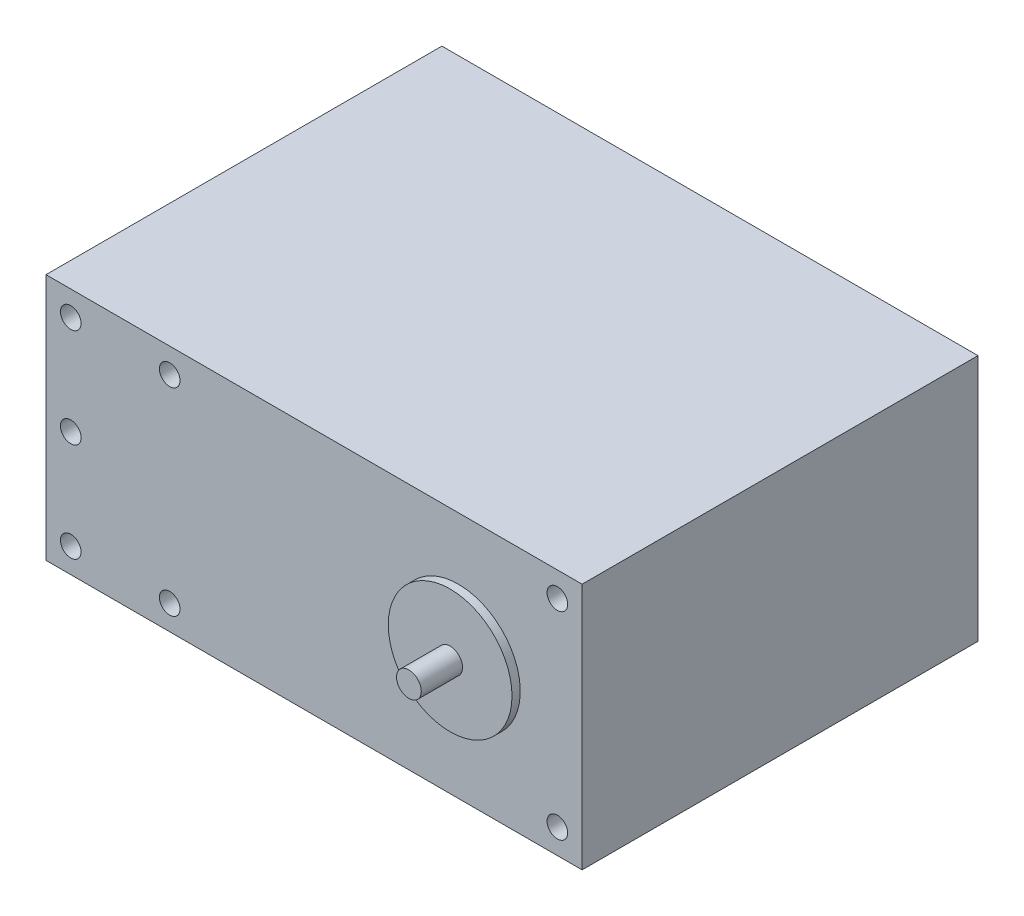
ISO-10303-21;
HEADER;
FILE_DESCRIPTION(('STEP AP214'),'2;1');
FILE_NAME('part.step','',(''),(''),'','','');
FILE_SCHEMA(('AUTOMOTIVE_DESIGN { 1 0 10303 214 1 1 1 1 }'));
ENDSEC;
DATA;
#1=APPLICATION_CONTEXT('core data for automotive mechanical design processes');
#2=APPLICATION_PROTOCOL_DEFINITION('international standard','automotive_design',2000,#1);
#3=PRODUCT_CONTEXT('',#1,'mechanical');
#4=PRODUCT('Part','Part','',(#3));
#5=PRODUCT_RELATED_PRODUCT_CATEGORY('part','',(#4));
#6=PRODUCT_DEFINITION_FORMATION('','',#4);
#7=PRODUCT_DEFINITION_CONTEXT('part definition',#1,'design');
#8=PRODUCT_DEFINITION('design','',#6,#7);
#9=PRODUCT_DEFINITION_SHAPE('','',#8);
#10=(LENGTH_UNIT() NAMED_UNIT(*) SI_UNIT(.MILLI.,.METRE.));
#11=(NAMED_UNIT(*) PLANE_ANGLE_UNIT() SI_UNIT($,.RADIAN.));
#12=(NAMED_UNIT(*) SI_UNIT($,.STERADIAN.) SOLID_ANGLE_UNIT());
#13=UNCERTAINTY_MEASURE_WITH_UNIT(LENGTH_MEASURE(1.E-05),#10,'distance_accuracy_value','');
#14=(GEOMETRIC_REPRESENTATION_CONTEXT(3) GLOBAL_UNCERTAINTY_ASSIGNED_CONTEXT((#13)) GLOBAL_UNIT_ASSIGNED_CONTEXT((#10,
#11,#12)) REPRESENTATION_CONTEXT('',''));
#15=CARTESIAN_POINT('',(0.,0.,0.));
#16=DIRECTION('',(0.,0.,1.));
#17=DIRECTION('',(1.,0.,0.));
#18=AXIS2_PLACEMENT_3D('',#15,#16,#17);
#19=CARTESIAN_POINT('',(0.,0.,48.));
#20=DIRECTION('',(1.,0.,0.));
#21=DIRECTION('',(0.,0.,-1.));
#22=AXIS2_PLACEMENT_3D('',#19,#20,#21);
#23=PLANE('',#22);
#24=DIRECTION('',(0.,-1.,0.));
#25=VECTOR('',#24,1.);
#26=CARTESIAN_POINT('',(0.,0.,0.));
#27=LINE('',#26,#25);
#28=CARTESIAN_POINT('',(0.,30.,0.));
#29=VERTEX_POINT('',#28);
#30=CARTESIAN_POINT('',(0.,0.,0.));
#31=VERTEX_POINT('',#30);
#32=EDGE_CURVE('E99',#29,#31,#27,.T.);
#33=ORIENTED_EDGE('',*,*,#32,.T.);
#34=DIRECTION('',(0.,0.,-1.));
#35=VECTOR('',#34,1.);
#36=CARTESIAN_POINT('',(0.,0.,48.));
#37=LINE('',#36,#35);
#38=CARTESIAN_POINT('',(0.,0.,48.));
#39=VERTEX_POINT('',#38);
#40=EDGE_CURVE('E41',#39,#31,#37,.T.);
#41=ORIENTED_EDGE('',*,*,#40,.F.);
#42=DIRECTION('',(0.,-1.,0.));
#43=VECTOR('',#42,1.);
#44=CARTESIAN_POINT('',(0.,0.,48.));
#45=LINE('',#44,#43);
#46=CARTESIAN_POINT('',(0.,30.,48.));
#47=VERTEX_POINT('',#46);
#48=EDGE_CURVE('E85',#47,#39,#45,.T.);
#49=ORIENTED_EDGE('',*,*,#48,.F.);
#50=DIRECTION('',(0.,0.,-1.));
#51=VECTOR('',#50,1.);
#52=CARTESIAN_POINT('',(0.,30.,48.));
#53=LINE('',#52,#51);
#54=EDGE_CURVE('E95',#47,#29,#53,.T.);
#55=ORIENTED_EDGE('',*,*,#54,.T.);
#56=EDGE_LOOP('',(#33,#41,#49,#55));
#57=FACE_BOUND('',#56,.T.);
#58=ADVANCED_FACE('F33',(#57),#23,.F.);
#59=CARTESIAN_POINT('',(0.,0.,48.));
#60=DIRECTION('',(0.,1.,0.));
#61=DIRECTION('',(0.,0.,1.));
#62=AXIS2_PLACEMENT_3D('',#59,#60,#61);
#63=PLANE('',#62);
#64=DIRECTION('',(1.,0.,0.));
#65=VECTOR('',#64,1.);
#66=CARTESIAN_POINT('',(0.,0.,0.));
#67=LINE('',#66,#65);
#68=CARTESIAN_POINT('',(65.,0.,0.));
#69=VERTEX_POINT('',#68);
#70=EDGE_CURVE('E90',#31,#69,#67,.T.);
#71=ORIENTED_EDGE('',*,*,#70,.T.);
#72=DIRECTION('',(0.,0.,-1.));
#73=VECTOR('',#72,1.);
#74=CARTESIAN_POINT('',(65.,0.,48.));
#75=LINE('',#74,#73);
#76=CARTESIAN_POINT('',(65.,0.,48.));
#77=VERTEX_POINT('',#76);
#78=EDGE_CURVE('E88',#77,#69,#75,.T.);
#79=ORIENTED_EDGE('',*,*,#78,.F.);
#80=DIRECTION('',(1.,0.,0.));
#81=VECTOR('',#80,1.);
#82=CARTESIAN_POINT('',(0.,0.,48.));
#83=LINE('',#82,#81);
#84=EDGE_CURVE('E80',#39,#77,#83,.T.);
#85=ORIENTED_EDGE('',*,*,#84,.F.);
#86=ORIENTED_EDGE('',*,*,#40,.T.);
#87=EDGE_LOOP('',(#71,#79,#85,#86));
#88=FACE_BOUND('',#87,.T.);
#89=ADVANCED_FACE('F89',(#88),#63,.F.);
#90=CARTESIAN_POINT('',(65.,0.,48.));
#91=DIRECTION('',(-1.,0.,0.));
#92=DIRECTION('',(0.,0.,1.));
#93=AXIS2_PLACEMENT_3D('',#90,#91,#92);
#94=PLANE('',#93);
#95=DIRECTION('',(0.,1.,0.));
#96=VECTOR('',#95,1.);
#97=CARTESIAN_POINT('',(65.,0.,0.));
#98=LINE('',#97,#96);
#99=CARTESIAN_POINT('',(65.,30.,0.));
#100=VERTEX_POINT('',#99);
#101=EDGE_CURVE('E66',#69,#100,#98,.T.);
#102=ORIENTED_EDGE('',*,*,#101,.T.);
#103=DIRECTION('',(0.,0.,-1.));
#104=VECTOR('',#103,1.);
#105=CARTESIAN_POINT('',(65.,30.,48.));
#106=LINE('',#105,#104);
#107=CARTESIAN_POINT('',(65.,30.,48.));
#108=VERTEX_POINT('',#107);
#109=EDGE_CURVE('E91',#108,#100,#106,.T.);
#110=ORIENTED_EDGE('',*,*,#109,.F.);
#111=DIRECTION('',(0.,1.,0.));
#112=VECTOR('',#111,1.);
#113=CARTESIAN_POINT('',(65.,0.,48.));
#114=LINE('',#113,#112);
#115=EDGE_CURVE('E83',#77,#108,#114,.T.);
#116=ORIENTED_EDGE('',*,*,#115,.F.);
#117=ORIENTED_EDGE('',*,*,#78,.T.);
#118=EDGE_LOOP('',(#102,#110,#116,#117));
#119=FACE_BOUND('',#118,.T.);
#120=ADVANCED_FACE('F93',(#119),#94,.F.);
#121=CARTESIAN_POINT('',(0.,30.,48.));
#122=DIRECTION('',(0.,-1.,0.));
#123=DIRECTION('',(0.,0.,-1.));
#124=AXIS2_PLACEMENT_3D('',#121,#122,#123);
#125=PLANE('',#124);
#126=DIRECTION('',(-1.,0.,0.));
#127=VECTOR('',#126,1.);
#128=CARTESIAN_POINT('',(0.,30.,0.));
#129=LINE('',#128,#127);
#130=EDGE_CURVE('E72',#100,#29,#129,.T.);
#131=ORIENTED_EDGE('',*,*,#130,.T.);
#132=ORIENTED_EDGE('',*,*,#54,.F.);
#133=DIRECTION('',(-1.,0.,0.));
#134=VECTOR('',#133,1.);
#135=CARTESIAN_POINT('',(0.,30.,48.));
#136=LINE('',#135,#134);
#137=EDGE_CURVE('E49',#108,#47,#136,.T.);
#138=ORIENTED_EDGE('',*,*,#137,.F.);
#139=ORIENTED_EDGE('',*,*,#109,.T.);
#140=EDGE_LOOP('',(#131,#132,#138,#139));
#141=FACE_BOUND('',#140,.T.);
#142=ADVANCED_FACE('F122',(#141),#125,.F.);
#143=CARTESIAN_POINT('',(0.,0.,48.));
#144=DIRECTION('',(0.,0.,-1.));
#145=DIRECTION('',(-1.,0.,0.));
#146=AXIS2_PLACEMENT_3D('',#143,#144,#145);
#147=PLANE('',#146);
#148=CARTESIAN_POINT('',(50.,15.,48.));
#149=DIRECTION('',(0.,0.,-1.));
#150=DIRECTION('',(-1.,0.,0.));
#151=AXIS2_PLACEMENT_3D('',#148,#149,#150);
#152=CIRCLE('',#151,7.5);
#153=CARTESIAN_POINT('',(42.5,15.,48.));
#154=VERTEX_POINT('',#153);
#155=EDGE_CURVE('E11',#154,#154,#152,.F.);
#156=ORIENTED_EDGE('',*,*,#155,.F.);
#157=EDGE_LOOP('',(#156));
#158=FACE_BOUND('',#157,.T.);
#159=CARTESIAN_POINT('',(62.,3.,48.));
#160=DIRECTION('',(0.,0.,1.));
#161=DIRECTION('',(1.,0.,0.));
#162=AXIS2_PLACEMENT_3D('',#159,#160,#161);
#163=CIRCLE('',#162,1.25);
#164=CARTESIAN_POINT('',(63.25,3.,48.));
#165=VERTEX_POINT('',#164);
#166=EDGE_CURVE('E421',#165,#165,#163,.T.);
#167=ORIENTED_EDGE('',*,*,#166,.F.);
#168=EDGE_LOOP('',(#167));
#169=FACE_BOUND('',#168,.T.);
#170=CARTESIAN_POINT('',(62.,27.,48.));
#171=DIRECTION('',(0.,0.,1.));
#172=DIRECTION('',(1.,0.,0.));
#173=AXIS2_PLACEMENT_3D('',#170,#171,#172);
#174=CIRCLE('',#173,1.25);
#175=CARTESIAN_POINT('',(63.25,27.,48.));
#176=VERTEX_POINT('',#175);
#177=EDGE_CURVE('E428',#176,#176,#174,.T.);
#178=ORIENTED_EDGE('',*,*,#177,.F.);
#179=EDGE_LOOP('',(#178));
#180=FACE_BOUND('',#179,.T.);
#181=CARTESIAN_POINT('',(15.,27.,48.));
#182=DIRECTION('',(0.,0.,1.));
#183=DIRECTION('',(1.,0.,0.));
#184=AXIS2_PLACEMENT_3D('',#181,#182,#183);
#185=CIRCLE('',#184,1.25);
#186=CARTESIAN_POINT('',(16.25,27.,48.));
#187=VERTEX_POINT('',#186);
#188=EDGE_CURVE('E442',#187,#187,#185,.T.);
#189=ORIENTED_EDGE('',*,*,#188,.F.);
#190=EDGE_LOOP('',(#189));
#191=FACE_BOUND('',#190,.T.);
#192=CARTESIAN_POINT('',(3.,3.,48.));
#193=DIRECTION('',(0.,0.,1.));
#194=DIRECTION('',(1.,0.,0.));
#195=AXIS2_PLACEMENT_3D('',#192,#193,#194);
#196=CIRCLE('',#195,1.25);
#197=CARTESIAN_POINT('',(4.25,3.,48.));
#198=VERTEX_POINT('',#197);
#199=EDGE_CURVE('E435',#198,#198,#196,.T.);
#200=ORIENTED_EDGE('',*,*,#199,.F.);
#201=EDGE_LOOP('',(#200));
#202=FACE_BOUND('',#201,.T.);
#203=CARTESIAN_POINT('',(3.,15.,48.));
#204=DIRECTION('',(0.,0.,1.));
#205=DIRECTION('',(1.,0.,0.));
#206=AXIS2_PLACEMENT_3D('',#203,#204,#205);
#207=CIRCLE('',#206,1.25);
#208=CARTESIAN_POINT('',(4.25,15.,48.));
#209=VERTEX_POINT('',#208);
#210=EDGE_CURVE('E452',#209,#209,#207,.T.);
#211=ORIENTED_EDGE('',*,*,#210,.F.);
#212=EDGE_LOOP('',(#211));
#213=FACE_BOUND('',#212,.T.);
#214=CARTESIAN_POINT('',(15.,3.,48.));
#215=DIRECTION('',(0.,0.,1.));
#216=DIRECTION('',(1.,0.,0.));
#217=AXIS2_PLACEMENT_3D('',#214,#215,#216);
#218=CIRCLE('',#217,1.25);
#219=CARTESIAN_POINT('',(16.25,3.,48.));
#220=VERTEX_POINT('',#219);
#221=EDGE_CURVE('E434',#220,#220,#218,.T.);
#222=ORIENTED_EDGE('',*,*,#221,.F.);
#223=EDGE_LOOP('',(#222));
#224=FACE_BOUND('',#223,.T.);
#225=CARTESIAN_POINT('',(3.,27.,48.));
#226=DIRECTION('',(0.,0.,1.));
#227=DIRECTION('',(1.,0.,0.));
#228=AXIS2_PLACEMENT_3D('',#225,#226,#227);
#229=CIRCLE('',#228,1.25);
#230=CARTESIAN_POINT('',(4.25,27.,48.));
#231=VERTEX_POINT('',#230);
#232=EDGE_CURVE('E415',#231,#231,#229,.T.);
#233=ORIENTED_EDGE('',*,*,#232,.F.);
#234=EDGE_LOOP('',(#233));
#235=FACE_BOUND('',#234,.T.);
#236=ORIENTED_EDGE('',*,*,#48,.T.);
#237=ORIENTED_EDGE('',*,*,#84,.T.);
#238=ORIENTED_EDGE('',*,*,#115,.T.);
#239=ORIENTED_EDGE('',*,*,#137,.T.);
#240=EDGE_LOOP('',(#236,#237,#238,#239));
#241=FACE_BOUND('',#240,.T.);
#242=ADVANCED_FACE('F81',(#158,#169,#180,#191,#202,#213,#224,#235,#241),#147,.F.);
#243=CARTESIAN_POINT('',(0.,0.,0.));
#244=DIRECTION('',(0.,0.,-1.));
#245=DIRECTION('',(-1.,0.,0.));
#246=AXIS2_PLACEMENT_3D('',#243,#244,#245);
#247=PLANE('',#246);
#248=CARTESIAN_POINT('',(50.,15.,0.));
#249=DIRECTION('',(0.,0.,-1.));
#250=DIRECTION('',(-1.,0.,0.));
#251=AXIS2_PLACEMENT_3D('',#248,#249,#250);
#252=CIRCLE('',#251,7.5);
#253=CARTESIAN_POINT('',(42.5,15.,0.));
#254=VERTEX_POINT('',#253);
#255=EDGE_CURVE('E502',#254,#254,#252,.T.);
#256=ORIENTED_EDGE('',*,*,#255,.F.);
#257=EDGE_LOOP('',(#256));
#258=FACE_BOUND('',#257,.T.);
#259=CARTESIAN_POINT('',(62.,27.,0.));
#260=DIRECTION('',(0.,0.,-1.));
#261=DIRECTION('',(-1.,0.,0.));
#262=AXIS2_PLACEMENT_3D('',#259,#260,#261);
#263=CIRCLE('',#262,1.25);
#264=CARTESIAN_POINT('',(60.75,27.,0.));
#265=VERTEX_POINT('',#264);
#266=EDGE_CURVE('E484',#265,#265,#263,.T.);
#267=ORIENTED_EDGE('',*,*,#266,.F.);
#268=EDGE_LOOP('',(#267));
#269=FACE_BOUND('',#268,.T.);
#270=CARTESIAN_POINT('',(27.,3.,0.));
#271=DIRECTION('',(0.,0.,-1.));
#272=DIRECTION('',(-1.,0.,0.));
#273=AXIS2_PLACEMENT_3D('',#270,#271,#272);
#274=CIRCLE('',#273,1.25);
#275=CARTESIAN_POINT('',(25.75,3.,0.));
#276=VERTEX_POINT('',#275);
#277=EDGE_CURVE('E491',#276,#276,#274,.T.);
#278=ORIENTED_EDGE('',*,*,#277,.F.);
#279=EDGE_LOOP('',(#278));
#280=FACE_BOUND('',#279,.T.);
#281=CARTESIAN_POINT('',(27.,27.,0.));
#282=DIRECTION('',(0.,0.,-1.));
#283=DIRECTION('',(-1.,0.,0.));
#284=AXIS2_PLACEMENT_3D('',#281,#282,#283);
#285=CIRCLE('',#284,1.25);
#286=CARTESIAN_POINT('',(25.75,27.,0.));
#287=VERTEX_POINT('',#286);
#288=EDGE_CURVE('E472',#287,#287,#285,.T.);
#289=ORIENTED_EDGE('',*,*,#288,.F.);
#290=EDGE_LOOP('',(#289));
#291=FACE_BOUND('',#290,.T.);
#292=CARTESIAN_POINT('',(3.,27.,0.));
#293=DIRECTION('',(0.,0.,-1.));
#294=DIRECTION('',(-1.,0.,0.));
#295=AXIS2_PLACEMENT_3D('',#292,#293,#294);
#296=CIRCLE('',#295,1.25);
#297=CARTESIAN_POINT('',(1.75,27.,0.));
#298=VERTEX_POINT('',#297);
#299=EDGE_CURVE('E479',#298,#298,#296,.T.);
#300=ORIENTED_EDGE('',*,*,#299,.F.);
#301=EDGE_LOOP('',(#300));
#302=FACE_BOUND('',#301,.T.);
#303=CARTESIAN_POINT('',(62.,3.,0.));
#304=DIRECTION('',(0.,0.,-1.));
#305=DIRECTION('',(-1.,0.,0.));
#306=AXIS2_PLACEMENT_3D('',#303,#304,#305);
#307=CIRCLE('',#306,1.25);
#308=CARTESIAN_POINT('',(60.75,3.,0.));
#309=VERTEX_POINT('',#308);
#310=EDGE_CURVE('E496',#309,#309,#307,.T.);
#311=ORIENTED_EDGE('',*,*,#310,.F.);
#312=EDGE_LOOP('',(#311));
#313=FACE_BOUND('',#312,.T.);
#314=CARTESIAN_POINT('',(3.,3.,0.));
#315=DIRECTION('',(0.,0.,-1.));
#316=DIRECTION('',(-1.,0.,0.));
#317=AXIS2_PLACEMENT_3D('',#314,#315,#316);
#318=CIRCLE('',#317,1.25);
#319=CARTESIAN_POINT('',(1.75,3.,0.));
#320=VERTEX_POINT('',#319);
#321=EDGE_CURVE('E466',#320,#320,#318,.T.);
#322=ORIENTED_EDGE('',*,*,#321,.F.);
#323=EDGE_LOOP('',(#322));
#324=FACE_BOUND('',#323,.T.);
#325=ORIENTED_EDGE('',*,*,#32,.F.);
#326=ORIENTED_EDGE('',*,*,#130,.F.);
#327=ORIENTED_EDGE('',*,*,#101,.F.);
#328=ORIENTED_EDGE('',*,*,#70,.F.);
#329=EDGE_LOOP('',(#325,#326,#327,#328));
#330=FACE_BOUND('',#329,.T.);
#331=ADVANCED_FACE('F110',(#258,#269,#280,#291,#302,#313,#324,#330),#247,.T.);
#332=CARTESIAN_POINT('',(3.,27.,45.));
#333=DIRECTION('',(0.,0.,1.));
#334=DIRECTION('',(1.,0.,0.));
#335=AXIS2_PLACEMENT_3D('',#332,#333,#334);
#336=CYLINDRICAL_SURFACE('',#335,1.25);
#337=CARTESIAN_POINT('',(3.,27.,45.));
#338=DIRECTION('',(0.,0.,1.));
#339=DIRECTION('',(1.,0.,0.));
#340=AXIS2_PLACEMENT_3D('',#337,#338,#339);
#341=CIRCLE('',#340,1.25);
#342=CARTESIAN_POINT('',(4.25,27.,45.));
#343=VERTEX_POINT('',#342);
#344=EDGE_CURVE('E102',#343,#343,#341,.T.);
#345=ORIENTED_EDGE('',*,*,#344,.F.);
#346=EDGE_LOOP('',(#345));
#347=FACE_BOUND('',#346,.T.);
#348=ORIENTED_EDGE('',*,*,#232,.T.);
#349=EDGE_LOOP('',(#348));
#350=FACE_BOUND('',#349,.T.);
#351=ADVANCED_FACE('F112',(#347,#350),#336,.F.);
#352=CARTESIAN_POINT('',(3.,27.,45.));
#353=DIRECTION('',(0.,0.,1.));
#354=DIRECTION('',(1.,0.,0.));
#355=AXIS2_PLACEMENT_3D('',#352,#353,#354);
#356=PLANE('',#355);
#357=ORIENTED_EDGE('',*,*,#344,.T.);
#358=EDGE_LOOP('',(#357));
#359=FACE_BOUND('',#358,.T.);
#360=ADVANCED_FACE('F119',(#359),#356,.T.);
#361=CARTESIAN_POINT('',(15.,3.,45.));
#362=DIRECTION('',(0.,0.,1.));
#363=DIRECTION('',(1.,0.,0.));
#364=AXIS2_PLACEMENT_3D('',#361,#362,#363);
#365=CYLINDRICAL_SURFACE('',#364,1.25);
#366=CARTESIAN_POINT('',(15.,3.,45.));
#367=DIRECTION('',(0.,0.,1.));
#368=DIRECTION('',(1.,0.,0.));
#369=AXIS2_PLACEMENT_3D('',#366,#367,#368);
#370=CIRCLE('',#369,1.25);
#371=CARTESIAN_POINT('',(16.25,3.,45.));
#372=VERTEX_POINT('',#371);
#373=EDGE_CURVE('E449',#372,#372,#370,.T.);
#374=ORIENTED_EDGE('',*,*,#373,.F.);
#375=EDGE_LOOP('',(#374));
#376=FACE_BOUND('',#375,.T.);
#377=ORIENTED_EDGE('',*,*,#221,.T.);
#378=EDGE_LOOP('',(#377));
#379=FACE_BOUND('',#378,.T.);
#380=ADVANCED_FACE('F375',(#376,#379),#365,.F.);
#381=CARTESIAN_POINT('',(15.,3.,45.));
#382=DIRECTION('',(0.,0.,1.));
#383=DIRECTION('',(1.,0.,0.));
#384=AXIS2_PLACEMENT_3D('',#381,#382,#383);
#385=PLANE('',#384);
#386=ORIENTED_EDGE('',*,*,#373,.T.);
#387=EDGE_LOOP('',(#386));
#388=FACE_BOUND('',#387,.T.);
#389=ADVANCED_FACE('F371',(#388),#385,.T.);
#390=CARTESIAN_POINT('',(3.,15.,45.));
#391=DIRECTION('',(0.,0.,1.));
#392=DIRECTION('',(1.,0.,0.));
#393=AXIS2_PLACEMENT_3D('',#390,#391,#392);
#394=CYLINDRICAL_SURFACE('',#393,1.25);
#395=CARTESIAN_POINT('',(3.,15.,45.));
#396=DIRECTION('',(0.,0.,1.));
#397=DIRECTION('',(1.,0.,0.));
#398=AXIS2_PLACEMENT_3D('',#395,#396,#397);
#399=CIRCLE('',#398,1.25);
#400=CARTESIAN_POINT('',(4.25,15.,45.));
#401=VERTEX_POINT('',#400);
#402=EDGE_CURVE('E439',#401,#401,#399,.T.);
#403=ORIENTED_EDGE('',*,*,#402,.F.);
#404=EDGE_LOOP('',(#403));
#405=FACE_BOUND('',#404,.T.);
#406=ORIENTED_EDGE('',*,*,#210,.T.);
#407=EDGE_LOOP('',(#406));
#408=FACE_BOUND('',#407,.T.);
#409=ADVANCED_FACE('F367',(#405,#408),#394,.F.);
#410=CARTESIAN_POINT('',(3.,15.,45.));
#411=DIRECTION('',(0.,0.,1.));
#412=DIRECTION('',(1.,0.,0.));
#413=AXIS2_PLACEMENT_3D('',#410,#411,#412);
#414=PLANE('',#413);
#415=ORIENTED_EDGE('',*,*,#402,.T.);
#416=EDGE_LOOP('',(#415));
#417=FACE_BOUND('',#416,.T.);
#418=ADVANCED_FACE('F363',(#417),#414,.T.);
#419=CARTESIAN_POINT('',(3.,3.,45.));
#420=DIRECTION('',(0.,0.,1.));
#421=DIRECTION('',(1.,0.,0.));
#422=AXIS2_PLACEMENT_3D('',#419,#420,#421);
#423=CYLINDRICAL_SURFACE('',#422,1.25);
#424=CARTESIAN_POINT('',(3.,3.,45.));
#425=DIRECTION('',(0.,0.,1.));
#426=DIRECTION('',(1.,0.,0.));
#427=AXIS2_PLACEMENT_3D('',#424,#425,#426);
#428=CIRCLE('',#427,1.25);
#429=CARTESIAN_POINT('',(4.25,3.,45.));
#430=VERTEX_POINT('',#429);
#431=EDGE_CURVE('E438',#430,#430,#428,.T.);
#432=ORIENTED_EDGE('',*,*,#431,.F.);
#433=EDGE_LOOP('',(#432));
#434=FACE_BOUND('',#433,.T.);
#435=ORIENTED_EDGE('',*,*,#199,.T.);
#436=EDGE_LOOP('',(#435));
#437=FACE_BOUND('',#436,.T.);
#438=ADVANCED_FACE('F366',(#434,#437),#423,.F.);
#439=CARTESIAN_POINT('',(3.,3.,45.));
#440=DIRECTION('',(0.,0.,1.));
#441=DIRECTION('',(1.,0.,0.));
#442=AXIS2_PLACEMENT_3D('',#439,#440,#441);
#443=PLANE('',#442);
#444=ORIENTED_EDGE('',*,*,#431,.T.);
#445=EDGE_LOOP('',(#444));
#446=FACE_BOUND('',#445,.T.);
#447=ADVANCED_FACE('F388',(#446),#443,.T.);
#448=CARTESIAN_POINT('',(15.,27.,45.));
#449=DIRECTION('',(0.,0.,1.));
#450=DIRECTION('',(1.,0.,0.));
#451=AXIS2_PLACEMENT_3D('',#448,#449,#450);
#452=CYLINDRICAL_SURFACE('',#451,1.25);
#453=CARTESIAN_POINT('',(15.,27.,45.));
#454=DIRECTION('',(0.,0.,1.));
#455=DIRECTION('',(1.,0.,0.));
#456=AXIS2_PLACEMENT_3D('',#453,#454,#455);
#457=CIRCLE('',#456,1.25);
#458=CARTESIAN_POINT('',(16.25,27.,45.));
#459=VERTEX_POINT('',#458);
#460=EDGE_CURVE('E418',#459,#459,#457,.T.);
#461=ORIENTED_EDGE('',*,*,#460,.F.);
#462=EDGE_LOOP('',(#461));
#463=FACE_BOUND('',#462,.T.);
#464=ORIENTED_EDGE('',*,*,#188,.T.);
#465=EDGE_LOOP('',(#464));
#466=FACE_BOUND('',#465,.T.);
#467=ADVANCED_FACE('F384',(#463,#466),#452,.F.);
#468=CARTESIAN_POINT('',(15.,27.,45.));
#469=DIRECTION('',(0.,0.,1.));
#470=DIRECTION('',(1.,0.,0.));
#471=AXIS2_PLACEMENT_3D('',#468,#469,#470);
#472=PLANE('',#471);
#473=ORIENTED_EDGE('',*,*,#460,.T.);
#474=EDGE_LOOP('',(#473));
#475=FACE_BOUND('',#474,.T.);
#476=ADVANCED_FACE('F380',(#475),#472,.T.);
#477=CARTESIAN_POINT('',(62.,27.,45.));
#478=DIRECTION('',(0.,0.,1.));
#479=DIRECTION('',(1.,0.,0.));
#480=AXIS2_PLACEMENT_3D('',#477,#478,#479);
#481=CYLINDRICAL_SURFACE('',#480,1.25);
#482=CARTESIAN_POINT('',(62.,27.,45.));
#483=DIRECTION('',(0.,0.,1.));
#484=DIRECTION('',(1.,0.,0.));
#485=AXIS2_PLACEMENT_3D('',#482,#483,#484);
#486=CIRCLE('',#485,1.25);
#487=CARTESIAN_POINT('',(63.25,27.,45.));
#488=VERTEX_POINT('',#487);
#489=EDGE_CURVE('E431',#488,#488,#486,.T.);
#490=ORIENTED_EDGE('',*,*,#489,.F.);
#491=EDGE_LOOP('',(#490));
#492=FACE_BOUND('',#491,.T.);
#493=ORIENTED_EDGE('',*,*,#177,.T.);
#494=EDGE_LOOP('',(#493));
#495=FACE_BOUND('',#494,.T.);
#496=ADVANCED_FACE('F383',(#492,#495),#481,.F.);
#497=CARTESIAN_POINT('',(62.,27.,45.));
#498=DIRECTION('',(0.,0.,1.));
#499=DIRECTION('',(1.,0.,0.));
#500=AXIS2_PLACEMENT_3D('',#497,#498,#499);
#501=PLANE('',#500);
#502=ORIENTED_EDGE('',*,*,#489,.T.);
#503=EDGE_LOOP('',(#502));
#504=FACE_BOUND('',#503,.T.);
#505=ADVANCED_FACE('F396',(#504),#501,.T.);
#506=CARTESIAN_POINT('',(62.,3.,45.));
#507=DIRECTION('',(0.,0.,1.));
#508=DIRECTION('',(1.,0.,0.));
#509=AXIS2_PLACEMENT_3D('',#506,#507,#508);
#510=CYLINDRICAL_SURFACE('',#509,1.25);
#511=CARTESIAN_POINT('',(62.,3.,45.));
#512=DIRECTION('',(0.,0.,1.));
#513=DIRECTION('',(1.,0.,0.));
#514=AXIS2_PLACEMENT_3D('',#511,#512,#513);
#515=CIRCLE('',#514,1.25);
#516=CARTESIAN_POINT('',(63.25,3.,45.));
#517=VERTEX_POINT('',#516);
#518=EDGE_CURVE('E424',#517,#517,#515,.T.);
#519=ORIENTED_EDGE('',*,*,#518,.F.);
#520=EDGE_LOOP('',(#519));
#521=FACE_BOUND('',#520,.T.);
#522=ORIENTED_EDGE('',*,*,#166,.T.);
#523=EDGE_LOOP('',(#522));
#524=FACE_BOUND('',#523,.T.);
#525=ADVANCED_FACE('F399',(#521,#524),#510,.F.);
#526=CARTESIAN_POINT('',(62.,3.,45.));
#527=DIRECTION('',(0.,0.,1.));
#528=DIRECTION('',(1.,0.,0.));
#529=AXIS2_PLACEMENT_3D('',#526,#527,#528);
#530=PLANE('',#529);
#531=ORIENTED_EDGE('',*,*,#518,.T.);
#532=EDGE_LOOP('',(#531));
#533=FACE_BOUND('',#532,.T.);
#534=ADVANCED_FACE('F153',(#533),#530,.T.);
#535=CARTESIAN_POINT('',(50.,15.,49.));
#536=DIRECTION('',(0.,0.,1.));
#537=DIRECTION('',(1.,0.,0.));
#538=AXIS2_PLACEMENT_3D('',#535,#536,#537);
#539=PLANE('',#538);
#540=CARTESIAN_POINT('',(50.,15.,49.));
#541=DIRECTION('',(0.,0.,1.));
#542=DIRECTION('',(1.,0.,0.));
#543=AXIS2_PLACEMENT_3D('',#540,#541,#542);
#544=CIRCLE('',#543,7.5);
#545=CARTESIAN_POINT('',(57.5,15.,49.));
#546=VERTEX_POINT('',#545);
#547=EDGE_CURVE('E425',#546,#546,#544,.T.);
#548=ORIENTED_EDGE('',*,*,#547,.T.);
#549=EDGE_LOOP('',(#548));
#550=FACE_BOUND('',#549,.T.);
#551=CARTESIAN_POINT('',(50.,15.,49.));
#552=DIRECTION('',(0.,0.,1.));
#553=DIRECTION('',(1.,0.,0.));
#554=AXIS2_PLACEMENT_3D('',#551,#552,#553);
#555=CIRCLE('',#554,1.5);
#556=CARTESIAN_POINT('',(51.5,15.,49.));
#557=VERTEX_POINT('',#556);
#558=EDGE_CURVE('E459',#557,#557,#555,.T.);
#559=ORIENTED_EDGE('',*,*,#558,.F.);
#560=EDGE_LOOP('',(#559));
#561=FACE_BOUND('',#560,.T.);
#562=ADVANCED_FACE('F158',(#550,#561),#539,.T.);
#563=CARTESIAN_POINT('',(50.,15.,49.));
#564=DIRECTION('',(0.,0.,-1.));
#565=DIRECTION('',(-1.,0.,0.));
#566=AXIS2_PLACEMENT_3D('',#563,#564,#565);
#567=CYLINDRICAL_SURFACE('',#566,7.5);
#568=ORIENTED_EDGE('',*,*,#547,.F.);
#569=EDGE_LOOP('',(#568));
#570=FACE_BOUND('',#569,.T.);
#571=ORIENTED_EDGE('',*,*,#155,.T.);
#572=EDGE_LOOP('',(#571));
#573=FACE_BOUND('',#572,.T.);
#574=ADVANCED_FACE('F163',(#570,#573),#567,.T.);
#575=CARTESIAN_POINT('',(50.,15.,54.));
#576=DIRECTION('',(0.,0.,-1.));
#577=DIRECTION('',(-1.,0.,0.));
#578=AXIS2_PLACEMENT_3D('',#575,#576,#577);
#579=CYLINDRICAL_SURFACE('',#578,1.5);
#580=ORIENTED_EDGE('',*,*,#558,.T.);
#581=EDGE_LOOP('',(#580));
#582=FACE_BOUND('',#581,.T.);
#583=CARTESIAN_POINT('',(50.,15.,54.));
#584=DIRECTION('',(0.,0.,1.));
#585=DIRECTION('',(1.,0.,0.));
#586=AXIS2_PLACEMENT_3D('',#583,#584,#585);
#587=CIRCLE('',#586,1.5);
#588=CARTESIAN_POINT('',(51.5,15.,54.));
#589=VERTEX_POINT('',#588);
#590=EDGE_CURVE('E462',#589,#589,#587,.T.);
#591=ORIENTED_EDGE('',*,*,#590,.F.);
#592=EDGE_LOOP('',(#591));
#593=FACE_BOUND('',#592,.T.);
#594=ADVANCED_FACE('F173',(#582,#593),#579,.T.);
#595=CARTESIAN_POINT('',(50.,15.,54.));
#596=DIRECTION('',(0.,0.,1.));
#597=DIRECTION('',(1.,0.,0.));
#598=AXIS2_PLACEMENT_3D('',#595,#596,#597);
#599=PLANE('',#598);
#600=ORIENTED_EDGE('',*,*,#590,.T.);
#601=EDGE_LOOP('',(#600));
#602=FACE_BOUND('',#601,.T.);
#603=ADVANCED_FACE('F183',(#602),#599,.T.);
#604=CARTESIAN_POINT('',(3.,3.,4.));
#605=DIRECTION('',(0.,0.,-1.));
#606=DIRECTION('',(-1.,0.,0.));
#607=AXIS2_PLACEMENT_3D('',#604,#605,#606);
#608=CYLINDRICAL_SURFACE('',#607,1.25);
#609=CARTESIAN_POINT('',(3.,3.,4.));
#610=DIRECTION('',(0.,0.,-1.));
#611=DIRECTION('',(-1.,0.,0.));
#612=AXIS2_PLACEMENT_3D('',#609,#610,#611);
#613=CIRCLE('',#612,1.25);
#614=CARTESIAN_POINT('',(1.75,3.,4.));
#615=VERTEX_POINT('',#614);
#616=EDGE_CURVE('E465',#615,#615,#613,.T.);
#617=ORIENTED_EDGE('',*,*,#616,.F.);
#618=EDGE_LOOP('',(#617));
#619=FACE_BOUND('',#618,.T.);
#620=ORIENTED_EDGE('',*,*,#321,.T.);
#621=EDGE_LOOP('',(#620));
#622=FACE_BOUND('',#621,.T.);
#623=ADVANCED_FACE('F193',(#619,#622),#608,.F.);
#624=CARTESIAN_POINT('',(3.,3.,4.));
#625=DIRECTION('',(0.,0.,-1.));
#626=DIRECTION('',(-1.,0.,0.));
#627=AXIS2_PLACEMENT_3D('',#624,#625,#626);
#628=PLANE('',#627);
#629=ORIENTED_EDGE('',*,*,#616,.T.);
#630=EDGE_LOOP('',(#629));
#631=FACE_BOUND('',#630,.T.);
#632=ADVANCED_FACE('F203',(#631),#628,.T.);
#633=CARTESIAN_POINT('',(62.,3.,4.));
#634=DIRECTION('',(0.,0.,-1.));
#635=DIRECTION('',(-1.,0.,0.));
#636=AXIS2_PLACEMENT_3D('',#633,#634,#635);
#637=CYLINDRICAL_SURFACE('',#636,1.25);
#638=CARTESIAN_POINT('',(62.,3.,4.));
#639=DIRECTION('',(0.,0.,-1.));
#640=DIRECTION('',(-1.,0.,0.));
#641=AXIS2_PLACEMENT_3D('',#638,#639,#640);
#642=CIRCLE('',#641,1.25);
#643=CARTESIAN_POINT('',(60.75,3.,4.));
#644=VERTEX_POINT('',#643);
#645=EDGE_CURVE('E488',#644,#644,#642,.T.);
#646=ORIENTED_EDGE('',*,*,#645,.F.);
#647=EDGE_LOOP('',(#646));
#648=FACE_BOUND('',#647,.T.);
#649=ORIENTED_EDGE('',*,*,#310,.T.);
#650=EDGE_LOOP('',(#649));
#651=FACE_BOUND('',#650,.T.);
#652=ADVANCED_FACE('F213',(#648,#651),#637,.F.);
#653=CARTESIAN_POINT('',(62.,3.,4.));
#654=DIRECTION('',(0.,0.,-1.));
#655=DIRECTION('',(-1.,0.,0.));
#656=AXIS2_PLACEMENT_3D('',#653,#654,#655);
#657=PLANE('',#656);
#658=ORIENTED_EDGE('',*,*,#645,.T.);
#659=EDGE_LOOP('',(#658));
#660=FACE_BOUND('',#659,.T.);
#661=ADVANCED_FACE('F223',(#660),#657,.T.);
#662=CARTESIAN_POINT('',(3.,27.,4.));
#663=DIRECTION('',(0.,0.,-1.));
#664=DIRECTION('',(-1.,0.,0.));
#665=AXIS2_PLACEMENT_3D('',#662,#663,#664);
#666=CYLINDRICAL_SURFACE('',#665,1.25);
#667=CARTESIAN_POINT('',(3.,27.,4.));
#668=DIRECTION('',(0.,0.,-1.));
#669=DIRECTION('',(-1.,0.,0.));
#670=AXIS2_PLACEMENT_3D('',#667,#668,#669);
#671=CIRCLE('',#670,1.25);
#672=CARTESIAN_POINT('',(1.75,27.,4.));
#673=VERTEX_POINT('',#672);
#674=EDGE_CURVE('E469',#673,#673,#671,.T.);
#675=ORIENTED_EDGE('',*,*,#674,.F.);
#676=EDGE_LOOP('',(#675));
#677=FACE_BOUND('',#676,.T.);
#678=ORIENTED_EDGE('',*,*,#299,.T.);
#679=EDGE_LOOP('',(#678));
#680=FACE_BOUND('',#679,.T.);
#681=ADVANCED_FACE('F233',(#677,#680),#666,.F.);
#682=CARTESIAN_POINT('',(3.,27.,4.));
#683=DIRECTION('',(0.,0.,-1.));
#684=DIRECTION('',(-1.,0.,0.));
#685=AXIS2_PLACEMENT_3D('',#682,#683,#684);
#686=PLANE('',#685);
#687=ORIENTED_EDGE('',*,*,#674,.T.);
#688=EDGE_LOOP('',(#687));
#689=FACE_BOUND('',#688,.T.);
#690=ADVANCED_FACE('F243',(#689),#686,.T.);
#691=CARTESIAN_POINT('',(27.,27.,4.));
#692=DIRECTION('',(0.,0.,-1.));
#693=DIRECTION('',(-1.,0.,0.));
#694=AXIS2_PLACEMENT_3D('',#691,#692,#693);
#695=CYLINDRICAL_SURFACE('',#694,1.25);
#696=CARTESIAN_POINT('',(27.,27.,4.));
#697=DIRECTION('',(0.,0.,-1.));
#698=DIRECTION('',(-1.,0.,0.));
#699=AXIS2_PLACEMENT_3D('',#696,#697,#698);
#700=CIRCLE('',#699,1.25);
#701=CARTESIAN_POINT('',(25.75,27.,4.));
#702=VERTEX_POINT('',#701);
#703=EDGE_CURVE('E475',#702,#702,#700,.T.);
#704=ORIENTED_EDGE('',*,*,#703,.F.);
#705=EDGE_LOOP('',(#704));
#706=FACE_BOUND('',#705,.T.);
#707=ORIENTED_EDGE('',*,*,#288,.T.);
#708=EDGE_LOOP('',(#707));
#709=FACE_BOUND('',#708,.T.);
#710=ADVANCED_FACE('F253',(#706,#709),#695,.F.);
#711=CARTESIAN_POINT('',(27.,27.,4.));
#712=DIRECTION('',(0.,0.,-1.));
#713=DIRECTION('',(-1.,0.,0.));
#714=AXIS2_PLACEMENT_3D('',#711,#712,#713);
#715=PLANE('',#714);
#716=ORIENTED_EDGE('',*,*,#703,.T.);
#717=EDGE_LOOP('',(#716));
#718=FACE_BOUND('',#717,.T.);
#719=ADVANCED_FACE('F263',(#718),#715,.T.);
#720=CARTESIAN_POINT('',(27.,3.,4.));
#721=DIRECTION('',(0.,0.,-1.));
#722=DIRECTION('',(-1.,0.,0.));
#723=AXIS2_PLACEMENT_3D('',#720,#721,#722);
#724=CYLINDRICAL_SURFACE('',#723,1.25);
#725=CARTESIAN_POINT('',(27.,3.,4.));
#726=DIRECTION('',(0.,0.,-1.));
#727=DIRECTION('',(-1.,0.,0.));
#728=AXIS2_PLACEMENT_3D('',#725,#726,#727);
#729=CIRCLE('',#728,1.25);
#730=CARTESIAN_POINT('',(25.75,3.,4.));
#731=VERTEX_POINT('',#730);
#732=EDGE_CURVE('E476',#731,#731,#729,.T.);
#733=ORIENTED_EDGE('',*,*,#732,.F.);
#734=EDGE_LOOP('',(#733));
#735=FACE_BOUND('',#734,.T.);
#736=ORIENTED_EDGE('',*,*,#277,.T.);
#737=EDGE_LOOP('',(#736));
#738=FACE_BOUND('',#737,.T.);
#739=ADVANCED_FACE('F273',(#735,#738),#724,.F.);
#740=CARTESIAN_POINT('',(27.,3.,4.));
#741=DIRECTION('',(0.,0.,-1.));
#742=DIRECTION('',(-1.,0.,0.));
#743=AXIS2_PLACEMENT_3D('',#740,#741,#742);
#744=PLANE('',#743);
#745=ORIENTED_EDGE('',*,*,#732,.T.);
#746=EDGE_LOOP('',(#745));
#747=FACE_BOUND('',#746,.T.);
#748=ADVANCED_FACE('F283',(#747),#744,.T.);
#749=CARTESIAN_POINT('',(62.,27.,4.));
#750=DIRECTION('',(0.,0.,-1.));
#751=DIRECTION('',(-1.,0.,0.));
#752=AXIS2_PLACEMENT_3D('',#749,#750,#751);
#753=CYLINDRICAL_SURFACE('',#752,1.25);
#754=CARTESIAN_POINT('',(62.,27.,4.));
#755=DIRECTION('',(0.,0.,-1.));
#756=DIRECTION('',(-1.,0.,0.));
#757=AXIS2_PLACEMENT_3D('',#754,#755,#756);
#758=CIRCLE('',#757,1.25);
#759=CARTESIAN_POINT('',(60.75,27.,4.));
#760=VERTEX_POINT('',#759);
#761=EDGE_CURVE('E487',#760,#760,#758,.T.);
#762=ORIENTED_EDGE('',*,*,#761,.F.);
#763=EDGE_LOOP('',(#762));
#764=FACE_BOUND('',#763,.T.);
#765=ORIENTED_EDGE('',*,*,#266,.T.);
#766=EDGE_LOOP('',(#765));
#767=FACE_BOUND('',#766,.T.);
#768=ADVANCED_FACE('F293',(#764,#767),#753,.F.);
#769=CARTESIAN_POINT('',(62.,27.,4.));
#770=DIRECTION('',(0.,0.,-1.));
#771=DIRECTION('',(-1.,0.,0.));
#772=AXIS2_PLACEMENT_3D('',#769,#770,#771);
#773=PLANE('',#772);
#774=ORIENTED_EDGE('',*,*,#761,.T.);
#775=EDGE_LOOP('',(#774));
#776=FACE_BOUND('',#775,.T.);
#777=ADVANCED_FACE('F303',(#776),#773,.T.);
#778=CARTESIAN_POINT('',(50.,15.,-1.));
#779=DIRECTION('',(0.,0.,-1.));
#780=DIRECTION('',(-1.,0.,0.));
#781=AXIS2_PLACEMENT_3D('',#778,#779,#780);
#782=PLANE('',#781);
#783=CARTESIAN_POINT('',(50.,15.,-1.));
#784=DIRECTION('',(0.,0.,-1.));
#785=DIRECTION('',(-1.,0.,0.));
#786=AXIS2_PLACEMENT_3D('',#783,#784,#785);
#787=CIRCLE('',#786,7.5);
#788=CARTESIAN_POINT('',(42.5,15.,-1.));
#789=VERTEX_POINT('',#788);
#790=EDGE_CURVE('E499',#789,#789,#787,.T.);
#791=ORIENTED_EDGE('',*,*,#790,.T.);
#792=EDGE_LOOP('',(#791));
#793=FACE_BOUND('',#792,.T.);
#794=CARTESIAN_POINT('',(50.,15.,-1.));
#795=DIRECTION('',(0.,0.,-1.));
#796=DIRECTION('',(-1.,0.,0.));
#797=AXIS2_PLACEMENT_3D('',#794,#795,#796);
#798=CIRCLE('',#797,1.5);
#799=CARTESIAN_POINT('',(48.5,15.,-1.));
#800=VERTEX_POINT('',#799);
#801=EDGE_CURVE('E505',#800,#800,#798,.T.);
#802=ORIENTED_EDGE('',*,*,#801,.F.);
#803=EDGE_LOOP('',(#802));
#804=FACE_BOUND('',#803,.T.);
#805=ADVANCED_FACE('F312',(#793,#804),#782,.T.);
#806=CARTESIAN_POINT('',(50.,15.,-1.));
#807=DIRECTION('',(0.,0.,1.));
#808=DIRECTION('',(1.,0.,0.));
#809=AXIS2_PLACEMENT_3D('',#806,#807,#808);
#810=CYLINDRICAL_SURFACE('',#809,7.5);
#811=ORIENTED_EDGE('',*,*,#790,.F.);
#812=EDGE_LOOP('',(#811));
#813=FACE_BOUND('',#812,.T.);
#814=ORIENTED_EDGE('',*,*,#255,.T.);
#815=EDGE_LOOP('',(#814));
#816=FACE_BOUND('',#815,.T.);
#817=ADVANCED_FACE('F327',(#813,#816),#810,.T.);
#818=CARTESIAN_POINT('',(50.,15.,-6.));
#819=DIRECTION('',(0.,0.,1.));
#820=DIRECTION('',(1.,0.,0.));
#821=AXIS2_PLACEMENT_3D('',#818,#819,#820);
#822=CYLINDRICAL_SURFACE('',#821,1.5);
#823=ORIENTED_EDGE('',*,*,#801,.T.);
#824=EDGE_LOOP('',(#823));
#825=FACE_BOUND('',#824,.T.);
#826=CARTESIAN_POINT('',(50.,15.,-6.));
#827=DIRECTION('',(0.,0.,-1.));
#828=DIRECTION('',(-1.,0.,0.));
#829=AXIS2_PLACEMENT_3D('',#826,#827,#828);
#830=CIRCLE('',#829,1.5);
#831=CARTESIAN_POINT('',(48.5,15.,-6.));
#832=VERTEX_POINT('',#831);
#833=EDGE_CURVE('E510',#832,#832,#830,.T.);
#834=ORIENTED_EDGE('',*,*,#833,.F.);
#835=EDGE_LOOP('',(#834));
#836=FACE_BOUND('',#835,.T.);
#837=ADVANCED_FACE('F337',(#825,#836),#822,.T.);
#838=CARTESIAN_POINT('',(50.,15.,-6.));
#839=DIRECTION('',(0.,0.,-1.));
#840=DIRECTION('',(-1.,0.,0.));
#841=AXIS2_PLACEMENT_3D('',#838,#839,#840);
#842=PLANE('',#841);
#843=ORIENTED_EDGE('',*,*,#833,.T.);
#844=EDGE_LOOP('',(#843));
#845=FACE_BOUND('',#844,.T.);
#846=ADVANCED_FACE('F347',(#845),#842,.T.);
#847=CLOSED_SHELL('',(#58,#89,#120,#142,#242,#331,#351,#360,#380,#389,#409,#418,#438,#447,#467,
#476,#496,#505,#525,#534,#562,#574,#594,#603,#623,#632,#652,#661,#681,#690,#710,#719,#739,#748,
#768,#777,#805,#817,#837,#846));
#848=MANIFOLD_SOLID_BREP('B2',#847);
#849=ADVANCED_BREP_SHAPE_REPRESENTATION('',(#18,#848),#14);
#850=SHAPE_DEFINITION_REPRESENTATION(#9,#849);
ENDSEC;
END-ISO-10303-21;
